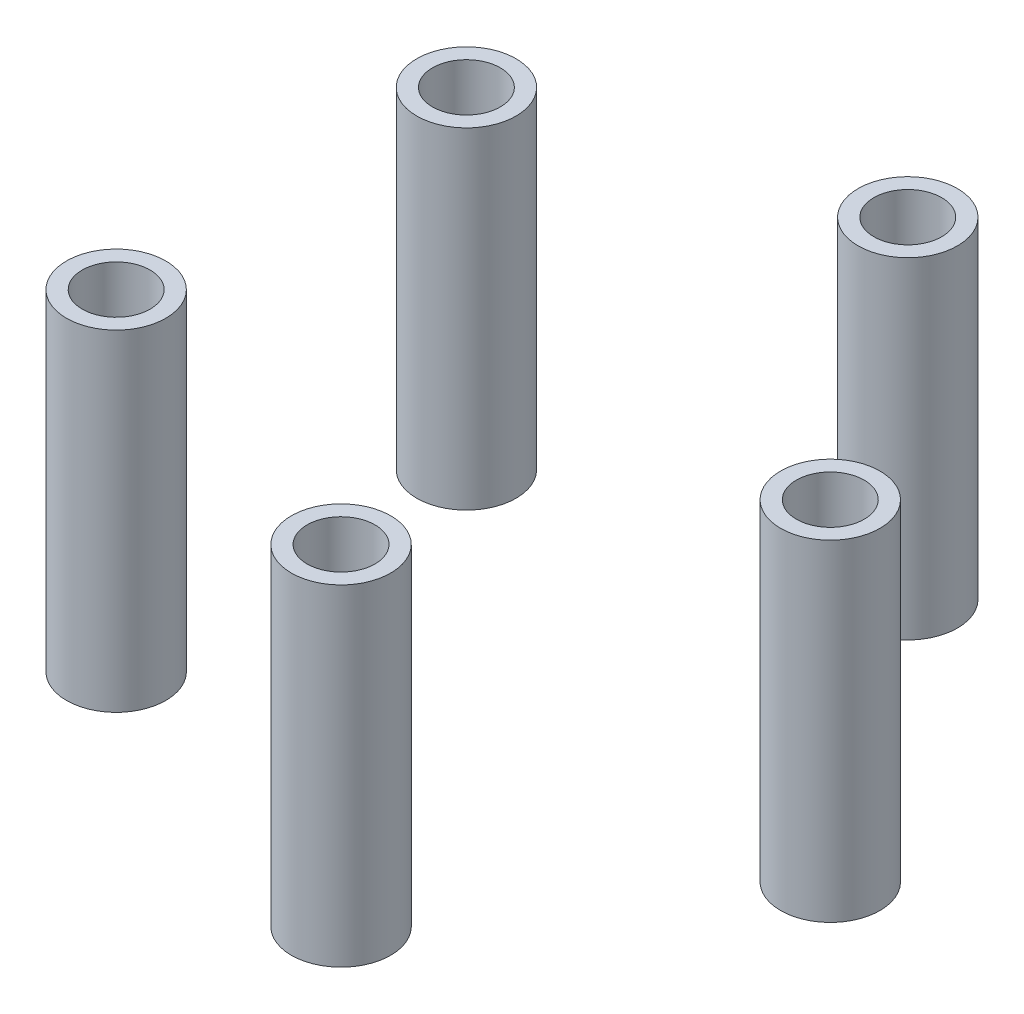
ISO-10303-21;
HEADER;
FILE_DESCRIPTION(('STEP AP214'),'2;1');
FILE_NAME('part.step','',(''),(''),'','','');
FILE_SCHEMA(('AUTOMOTIVE_DESIGN { 1 0 10303 214 1 1 1 1 }'));
ENDSEC;
DATA;
#1=APPLICATION_CONTEXT('core data for automotive mechanical design processes');
#2=APPLICATION_PROTOCOL_DEFINITION('international standard','automotive_design',2000,#1);
#3=PRODUCT_CONTEXT('',#1,'mechanical');
#4=PRODUCT('Part','Part','',(#3));
#5=PRODUCT_RELATED_PRODUCT_CATEGORY('part','',(#4));
#6=PRODUCT_DEFINITION_FORMATION('','',#4);
#7=PRODUCT_DEFINITION_CONTEXT('part definition',#1,'design');
#8=PRODUCT_DEFINITION('design','',#6,#7);
#9=PRODUCT_DEFINITION_SHAPE('','',#8);
#10=(LENGTH_UNIT() NAMED_UNIT(*) SI_UNIT(.MILLI.,.METRE.));
#11=(NAMED_UNIT(*) PLANE_ANGLE_UNIT() SI_UNIT($,.RADIAN.));
#12=(NAMED_UNIT(*) SI_UNIT($,.STERADIAN.) SOLID_ANGLE_UNIT());
#13=UNCERTAINTY_MEASURE_WITH_UNIT(LENGTH_MEASURE(1.E-05),#10,'distance_accuracy_value','');
#14=(GEOMETRIC_REPRESENTATION_CONTEXT(3) GLOBAL_UNCERTAINTY_ASSIGNED_CONTEXT((#13)) GLOBAL_UNIT_ASSIGNED_CONTEXT((#10,
#11,#12)) REPRESENTATION_CONTEXT('',''));
#15=CARTESIAN_POINT('',(0.,0.,0.));
#16=DIRECTION('',(0.,0.,1.));
#17=DIRECTION('',(1.,0.,0.));
#18=AXIS2_PLACEMENT_3D('',#15,#16,#17);
#19=CARTESIAN_POINT('',(4.36230589877687,-8.,-17.1190172933127));
#20=DIRECTION('',(0.,1.,0.));
#21=DIRECTION('',(0.,0.,1.));
#22=AXIS2_PLACEMENT_3D('',#19,#20,#21);
#23=CYLINDRICAL_SURFACE('',#22,3.);
#24=CARTESIAN_POINT('',(4.36230589877687,-8.,-17.1190172933127));
#25=DIRECTION('',(0.,1.,0.));
#26=DIRECTION('',(0.,0.,1.));
#27=AXIS2_PLACEMENT_3D('',#24,#25,#26);
#28=CIRCLE('',#27,3.);
#29=CARTESIAN_POINT('',(4.36230589877687,-8.,-14.1190172933127));
#30=VERTEX_POINT('',#29);
#31=EDGE_CURVE('E62',#30,#30,#28,.T.);
#32=ORIENTED_EDGE('',*,*,#31,.T.);
#33=EDGE_LOOP('',(#32));
#34=FACE_BOUND('',#33,.T.);
#35=CARTESIAN_POINT('',(4.36230589877687,12.,-17.1190172933127));
#36=DIRECTION('',(0.,1.,0.));
#37=DIRECTION('',(0.,0.,1.));
#38=AXIS2_PLACEMENT_3D('',#35,#36,#37);
#39=CIRCLE('',#38,3.);
#40=CARTESIAN_POINT('',(4.36230589877687,12.,-14.1190172933127));
#41=VERTEX_POINT('',#40);
#42=EDGE_CURVE('E52',#41,#41,#39,.T.);
#43=ORIENTED_EDGE('',*,*,#42,.F.);
#44=EDGE_LOOP('',(#43));
#45=FACE_BOUND('',#44,.T.);
#46=ADVANCED_FACE('F46',(#34,#45),#23,.T.);
#47=CARTESIAN_POINT('',(4.36230589877687,-8.,-17.1190172933127));
#48=DIRECTION('',(0.,1.,0.));
#49=DIRECTION('',(0.,0.,1.));
#50=AXIS2_PLACEMENT_3D('',#47,#48,#49);
#51=PLANE('',#50);
#52=CARTESIAN_POINT('',(4.36230589877687,-8.,-17.1190172933127));
#53=DIRECTION('',(0.,1.,0.));
#54=DIRECTION('',(0.,0.,1.));
#55=AXIS2_PLACEMENT_3D('',#52,#53,#54);
#56=CIRCLE('',#55,2.05);
#57=CARTESIAN_POINT('',(4.36230589877687,-8.,-15.0690172933127));
#58=VERTEX_POINT('',#57);
#59=EDGE_CURVE('E60',#58,#58,#56,.T.);
#60=ORIENTED_EDGE('',*,*,#59,.T.);
#61=EDGE_LOOP('',(#60));
#62=FACE_BOUND('',#61,.T.);
#63=ORIENTED_EDGE('',*,*,#31,.F.);
#64=EDGE_LOOP('',(#63));
#65=FACE_BOUND('',#64,.T.);
#66=ADVANCED_FACE('F69',(#62,#65),#51,.F.);
#67=CARTESIAN_POINT('',(4.36230589877687,-8.,-17.1190172933127));
#68=DIRECTION('',(0.,1.,0.));
#69=DIRECTION('',(0.,0.,1.));
#70=AXIS2_PLACEMENT_3D('',#67,#68,#69);
#71=CYLINDRICAL_SURFACE('',#70,2.05);
#72=ORIENTED_EDGE('',*,*,#59,.F.);
#73=EDGE_LOOP('',(#72));
#74=FACE_BOUND('',#73,.T.);
#75=CARTESIAN_POINT('',(4.36230589877687,12.,-17.1190172933127));
#76=DIRECTION('',(0.,1.,0.));
#77=DIRECTION('',(0.,0.,1.));
#78=AXIS2_PLACEMENT_3D('',#75,#76,#77);
#79=CIRCLE('',#78,2.05);
#80=CARTESIAN_POINT('',(4.36230589877687,12.,-15.0690172933127));
#81=VERTEX_POINT('',#80);
#82=EDGE_CURVE('E11',#81,#81,#79,.T.);
#83=ORIENTED_EDGE('',*,*,#82,.T.);
#84=EDGE_LOOP('',(#83));
#85=FACE_BOUND('',#84,.T.);
#86=ADVANCED_FACE('F72',(#74,#85),#71,.F.);
#87=CARTESIAN_POINT('',(4.36230589877687,12.,-17.1190172933127));
#88=DIRECTION('',(0.,1.,0.));
#89=DIRECTION('',(0.,0.,1.));
#90=AXIS2_PLACEMENT_3D('',#87,#88,#89);
#91=PLANE('',#90);
#92=ORIENTED_EDGE('',*,*,#42,.T.);
#93=EDGE_LOOP('',(#92));
#94=FACE_BOUND('',#93,.T.);
#95=ORIENTED_EDGE('',*,*,#82,.F.);
#96=EDGE_LOOP('',(#95));
#97=FACE_BOUND('',#96,.T.);
#98=ADVANCED_FACE('F48',(#94,#97),#91,.T.);
#99=CLOSED_SHELL('',(#46,#66,#86,#98));
#100=MANIFOLD_SOLID_BREP('B2',#99);
#101=CARTESIAN_POINT('',(-15.7623058987213,-8.,-10.5801345412646));
#102=DIRECTION('',(0.,1.,0.));
#103=DIRECTION('',(0.,0.,1.));
#104=AXIS2_PLACEMENT_3D('',#101,#102,#103);
#105=CYLINDRICAL_SURFACE('',#104,3.);
#106=CARTESIAN_POINT('',(-15.7623058987213,-8.,-10.5801345412646));
#107=DIRECTION('',(0.,1.,0.));
#108=DIRECTION('',(0.,0.,1.));
#109=AXIS2_PLACEMENT_3D('',#106,#107,#108);
#110=CIRCLE('',#109,3.);
#111=CARTESIAN_POINT('',(-15.7623058987213,-8.,-7.58013454126464));
#112=VERTEX_POINT('',#111);
#113=EDGE_CURVE('E131',#112,#112,#110,.T.);
#114=ORIENTED_EDGE('',*,*,#113,.T.);
#115=EDGE_LOOP('',(#114));
#116=FACE_BOUND('',#115,.T.);
#117=CARTESIAN_POINT('',(-15.7623058987213,12.,-10.5801345412646));
#118=DIRECTION('',(0.,1.,0.));
#119=DIRECTION('',(0.,0.,1.));
#120=AXIS2_PLACEMENT_3D('',#117,#118,#119);
#121=CIRCLE('',#120,3.);
#122=CARTESIAN_POINT('',(-15.7623058987213,12.,-7.58013454126464));
#123=VERTEX_POINT('',#122);
#124=EDGE_CURVE('E121',#123,#123,#121,.T.);
#125=ORIENTED_EDGE('',*,*,#124,.F.);
#126=EDGE_LOOP('',(#125));
#127=FACE_BOUND('',#126,.T.);
#128=ADVANCED_FACE('F117',(#116,#127),#105,.T.);
#129=CARTESIAN_POINT('',(-15.7623058987213,-8.,-10.5801345412646));
#130=DIRECTION('',(0.,1.,0.));
#131=DIRECTION('',(0.,0.,1.));
#132=AXIS2_PLACEMENT_3D('',#129,#130,#131);
#133=PLANE('',#132);
#134=CARTESIAN_POINT('',(-15.7623058987213,-8.,-10.5801345412646));
#135=DIRECTION('',(0.,1.,0.));
#136=DIRECTION('',(0.,0.,1.));
#137=AXIS2_PLACEMENT_3D('',#134,#135,#136);
#138=CIRCLE('',#137,2.05);
#139=CARTESIAN_POINT('',(-15.7623058987213,-8.,-8.53013454126464));
#140=VERTEX_POINT('',#139);
#141=EDGE_CURVE('E130',#140,#140,#138,.T.);
#142=ORIENTED_EDGE('',*,*,#141,.T.);
#143=EDGE_LOOP('',(#142));
#144=FACE_BOUND('',#143,.T.);
#145=ORIENTED_EDGE('',*,*,#113,.F.);
#146=EDGE_LOOP('',(#145));
#147=FACE_BOUND('',#146,.T.);
#148=ADVANCED_FACE('F137',(#144,#147),#133,.F.);
#149=CARTESIAN_POINT('',(-15.7623058987213,-8.,-10.5801345412646));
#150=DIRECTION('',(0.,1.,0.));
#151=DIRECTION('',(0.,0.,1.));
#152=AXIS2_PLACEMENT_3D('',#149,#150,#151);
#153=CYLINDRICAL_SURFACE('',#152,2.05);
#154=ORIENTED_EDGE('',*,*,#141,.F.);
#155=EDGE_LOOP('',(#154));
#156=FACE_BOUND('',#155,.T.);
#157=CARTESIAN_POINT('',(-15.7623058987213,12.,-10.5801345412646));
#158=DIRECTION('',(0.,1.,0.));
#159=DIRECTION('',(0.,0.,1.));
#160=AXIS2_PLACEMENT_3D('',#157,#158,#159);
#161=CIRCLE('',#160,2.05);
#162=CARTESIAN_POINT('',(-15.7623058987213,12.,-8.53013454126464));
#163=VERTEX_POINT('',#162);
#164=EDGE_CURVE('E44',#163,#163,#161,.T.);
#165=ORIENTED_EDGE('',*,*,#164,.T.);
#166=EDGE_LOOP('',(#165));
#167=FACE_BOUND('',#166,.T.);
#168=ADVANCED_FACE('F141',(#156,#167),#153,.F.);
#169=CARTESIAN_POINT('',(-15.7623058987213,12.,-10.5801345412646));
#170=DIRECTION('',(0.,1.,0.));
#171=DIRECTION('',(0.,0.,1.));
#172=AXIS2_PLACEMENT_3D('',#169,#170,#171);
#173=PLANE('',#172);
#174=ORIENTED_EDGE('',*,*,#124,.T.);
#175=EDGE_LOOP('',(#174));
#176=FACE_BOUND('',#175,.T.);
#177=ORIENTED_EDGE('',*,*,#164,.F.);
#178=EDGE_LOOP('',(#177));
#179=FACE_BOUND('',#178,.T.);
#180=ADVANCED_FACE('F118',(#176,#179),#173,.T.);
#181=CLOSED_SHELL('',(#128,#148,#168,#180));
#182=MANIFOLD_SOLID_BREP('B6',#181);
#183=CARTESIAN_POINT('',(16.8000000000276,-8.,0.));
#184=DIRECTION('',(0.,1.,0.));
#185=DIRECTION('',(0.,0.,1.));
#186=AXIS2_PLACEMENT_3D('',#183,#184,#185);
#187=CYLINDRICAL_SURFACE('',#186,3.);
#188=CARTESIAN_POINT('',(16.8000000000276,-8.,0.));
#189=DIRECTION('',(0.,1.,0.));
#190=DIRECTION('',(0.,0.,1.));
#191=AXIS2_PLACEMENT_3D('',#188,#189,#190);
#192=CIRCLE('',#191,3.);
#193=CARTESIAN_POINT('',(16.8000000000276,-8.,3.));
#194=VERTEX_POINT('',#193);
#195=EDGE_CURVE('E202',#194,#194,#192,.T.);
#196=ORIENTED_EDGE('',*,*,#195,.T.);
#197=EDGE_LOOP('',(#196));
#198=FACE_BOUND('',#197,.T.);
#199=CARTESIAN_POINT('',(16.8000000000276,12.,0.));
#200=DIRECTION('',(0.,1.,0.));
#201=DIRECTION('',(0.,0.,1.));
#202=AXIS2_PLACEMENT_3D('',#199,#200,#201);
#203=CIRCLE('',#202,3.);
#204=CARTESIAN_POINT('',(16.8000000000276,12.,3.));
#205=VERTEX_POINT('',#204);
#206=EDGE_CURVE('E194',#205,#205,#203,.T.);
#207=ORIENTED_EDGE('',*,*,#206,.F.);
#208=EDGE_LOOP('',(#207));
#209=FACE_BOUND('',#208,.T.);
#210=ADVANCED_FACE('F186',(#198,#209),#187,.T.);
#211=CARTESIAN_POINT('',(16.8000000000276,-8.,0.));
#212=DIRECTION('',(0.,1.,0.));
#213=DIRECTION('',(0.,0.,1.));
#214=AXIS2_PLACEMENT_3D('',#211,#212,#213);
#215=PLANE('',#214);
#216=CARTESIAN_POINT('',(16.8000000000276,-8.,0.));
#217=DIRECTION('',(0.,1.,0.));
#218=DIRECTION('',(0.,0.,1.));
#219=AXIS2_PLACEMENT_3D('',#216,#217,#218);
#220=CIRCLE('',#219,2.05);
#221=CARTESIAN_POINT('',(16.8000000000276,-8.,2.05));
#222=VERTEX_POINT('',#221);
#223=EDGE_CURVE('E200',#222,#222,#220,.T.);
#224=ORIENTED_EDGE('',*,*,#223,.T.);
#225=EDGE_LOOP('',(#224));
#226=FACE_BOUND('',#225,.T.);
#227=ORIENTED_EDGE('',*,*,#195,.F.);
#228=EDGE_LOOP('',(#227));
#229=FACE_BOUND('',#228,.T.);
#230=ADVANCED_FACE('F209',(#226,#229),#215,.F.);
#231=CARTESIAN_POINT('',(16.8000000000276,-8.,0.));
#232=DIRECTION('',(0.,1.,0.));
#233=DIRECTION('',(0.,0.,1.));
#234=AXIS2_PLACEMENT_3D('',#231,#232,#233);
#235=CYLINDRICAL_SURFACE('',#234,2.05);
#236=ORIENTED_EDGE('',*,*,#223,.F.);
#237=EDGE_LOOP('',(#236));
#238=FACE_BOUND('',#237,.T.);
#239=CARTESIAN_POINT('',(16.8000000000276,12.,0.));
#240=DIRECTION('',(0.,1.,0.));
#241=DIRECTION('',(0.,0.,1.));
#242=AXIS2_PLACEMENT_3D('',#239,#240,#241);
#243=CIRCLE('',#242,2.05);
#244=CARTESIAN_POINT('',(16.8000000000276,12.,2.05));
#245=VERTEX_POINT('',#244);
#246=EDGE_CURVE('E113',#245,#245,#243,.T.);
#247=ORIENTED_EDGE('',*,*,#246,.T.);
#248=EDGE_LOOP('',(#247));
#249=FACE_BOUND('',#248,.T.);
#250=ADVANCED_FACE('F213',(#238,#249),#235,.F.);
#251=CARTESIAN_POINT('',(16.8000000000276,12.,0.));
#252=DIRECTION('',(0.,1.,0.));
#253=DIRECTION('',(0.,0.,1.));
#254=AXIS2_PLACEMENT_3D('',#251,#252,#253);
#255=PLANE('',#254);
#256=ORIENTED_EDGE('',*,*,#206,.T.);
#257=EDGE_LOOP('',(#256));
#258=FACE_BOUND('',#257,.T.);
#259=ORIENTED_EDGE('',*,*,#246,.F.);
#260=EDGE_LOOP('',(#259));
#261=FACE_BOUND('',#260,.T.);
#262=ADVANCED_FACE('F187',(#258,#261),#255,.T.);
#263=CLOSED_SHELL('',(#210,#230,#250,#262));
#264=MANIFOLD_SOLID_BREP('B37',#263);
#265=CARTESIAN_POINT('',(4.36230589877663,-8.,17.1190172933128));
#266=DIRECTION('',(0.,1.,0.));
#267=DIRECTION('',(0.,0.,1.));
#268=AXIS2_PLACEMENT_3D('',#265,#266,#267);
#269=CYLINDRICAL_SURFACE('',#268,3.);
#270=CARTESIAN_POINT('',(4.36230589877663,-8.,17.1190172933128));
#271=DIRECTION('',(0.,1.,0.));
#272=DIRECTION('',(0.,0.,1.));
#273=AXIS2_PLACEMENT_3D('',#270,#271,#272);
#274=CIRCLE('',#273,3.);
#275=CARTESIAN_POINT('',(4.36230589877663,-8.,20.1190172933128));
#276=VERTEX_POINT('',#275);
#277=EDGE_CURVE('E269',#276,#276,#274,.T.);
#278=ORIENTED_EDGE('',*,*,#277,.T.);
#279=EDGE_LOOP('',(#278));
#280=FACE_BOUND('',#279,.T.);
#281=CARTESIAN_POINT('',(4.36230589877663,12.,17.1190172933128));
#282=DIRECTION('',(0.,1.,0.));
#283=DIRECTION('',(0.,0.,1.));
#284=AXIS2_PLACEMENT_3D('',#281,#282,#283);
#285=CIRCLE('',#284,3.);
#286=CARTESIAN_POINT('',(4.36230589877663,12.,20.1190172933128));
#287=VERTEX_POINT('',#286);
#288=EDGE_CURVE('E265',#287,#287,#285,.T.);
#289=ORIENTED_EDGE('',*,*,#288,.F.);
#290=EDGE_LOOP('',(#289));
#291=FACE_BOUND('',#290,.T.);
#292=ADVANCED_FACE('F251',(#280,#291),#269,.T.);
#293=CARTESIAN_POINT('',(4.36230589877663,-8.,17.1190172933128));
#294=DIRECTION('',(0.,1.,0.));
#295=DIRECTION('',(0.,0.,1.));
#296=AXIS2_PLACEMENT_3D('',#293,#294,#295);
#297=PLANE('',#296);
#298=CARTESIAN_POINT('',(4.36230589877663,-8.,17.1190172933128));
#299=DIRECTION('',(0.,1.,0.));
#300=DIRECTION('',(0.,0.,1.));
#301=AXIS2_PLACEMENT_3D('',#298,#299,#300);
#302=CIRCLE('',#301,2.05);
#303=CARTESIAN_POINT('',(4.36230589877663,-8.,19.1690172933128));
#304=VERTEX_POINT('',#303);
#305=EDGE_CURVE('E266',#304,#304,#302,.T.);
#306=ORIENTED_EDGE('',*,*,#305,.T.);
#307=EDGE_LOOP('',(#306));
#308=FACE_BOUND('',#307,.T.);
#309=ORIENTED_EDGE('',*,*,#277,.F.);
#310=EDGE_LOOP('',(#309));
#311=FACE_BOUND('',#310,.T.);
#312=ADVANCED_FACE('F277',(#308,#311),#297,.F.);
#313=CARTESIAN_POINT('',(4.36230589877663,-8.,17.1190172933128));
#314=DIRECTION('',(0.,1.,0.));
#315=DIRECTION('',(0.,0.,1.));
#316=AXIS2_PLACEMENT_3D('',#313,#314,#315);
#317=CYLINDRICAL_SURFACE('',#316,2.05);
#318=ORIENTED_EDGE('',*,*,#305,.F.);
#319=EDGE_LOOP('',(#318));
#320=FACE_BOUND('',#319,.T.);
#321=CARTESIAN_POINT('',(4.36230589877663,12.,17.1190172933128));
#322=DIRECTION('',(0.,1.,0.));
#323=DIRECTION('',(0.,0.,1.));
#324=AXIS2_PLACEMENT_3D('',#321,#322,#323);
#325=CIRCLE('',#324,2.05);
#326=CARTESIAN_POINT('',(4.36230589877663,12.,19.1690172933128));
#327=VERTEX_POINT('',#326);
#328=EDGE_CURVE('E184',#327,#327,#325,.T.);
#329=ORIENTED_EDGE('',*,*,#328,.T.);
#330=EDGE_LOOP('',(#329));
#331=FACE_BOUND('',#330,.T.);
#332=ADVANCED_FACE('F279',(#320,#331),#317,.F.);
#333=CARTESIAN_POINT('',(4.36230589877663,12.,17.1190172933128));
#334=DIRECTION('',(0.,1.,0.));
#335=DIRECTION('',(0.,0.,1.));
#336=AXIS2_PLACEMENT_3D('',#333,#334,#335);
#337=PLANE('',#336);
#338=ORIENTED_EDGE('',*,*,#288,.T.);
#339=EDGE_LOOP('',(#338));
#340=FACE_BOUND('',#339,.T.);
#341=ORIENTED_EDGE('',*,*,#328,.F.);
#342=EDGE_LOOP('',(#341));
#343=FACE_BOUND('',#342,.T.);
#344=ADVANCED_FACE('F257',(#340,#343),#337,.T.);
#345=CLOSED_SHELL('',(#292,#312,#332,#344));
#346=MANIFOLD_SOLID_BREP('B106',#345);
#347=CARTESIAN_POINT('',(-15.7623058987215,-8.,10.5801345412644));
#348=DIRECTION('',(0.,1.,0.));
#349=DIRECTION('',(0.,0.,1.));
#350=AXIS2_PLACEMENT_3D('',#347,#348,#349);
#351=CYLINDRICAL_SURFACE('',#350,3.);
#352=CARTESIAN_POINT('',(-15.7623058987215,-8.,10.5801345412644));
#353=DIRECTION('',(0.,1.,0.));
#354=DIRECTION('',(0.,0.,1.));
#355=AXIS2_PLACEMENT_3D('',#352,#353,#354);
#356=CIRCLE('',#355,3.);
#357=CARTESIAN_POINT('',(-15.7623058987215,-8.,13.5801345412644));
#358=VERTEX_POINT('',#357);
#359=EDGE_CURVE('E254',#358,#358,#356,.T.);
#360=ORIENTED_EDGE('',*,*,#359,.T.);
#361=EDGE_LOOP('',(#360));
#362=FACE_BOUND('',#361,.T.);
#363=CARTESIAN_POINT('',(-15.7623058987215,12.,10.5801345412644));
#364=DIRECTION('',(0.,1.,0.));
#365=DIRECTION('',(0.,0.,1.));
#366=AXIS2_PLACEMENT_3D('',#363,#364,#365);
#367=CIRCLE('',#366,3.);
#368=CARTESIAN_POINT('',(-15.7623058987215,12.,13.5801345412644));
#369=VERTEX_POINT('',#368);
#370=EDGE_CURVE('E330',#369,#369,#367,.T.);
#371=ORIENTED_EDGE('',*,*,#370,.F.);
#372=EDGE_LOOP('',(#371));
#373=FACE_BOUND('',#372,.T.);
#374=ADVANCED_FACE('F320',(#362,#373),#351,.T.);
#375=CARTESIAN_POINT('',(-15.7623058987215,-8.,10.5801345412644));
#376=DIRECTION('',(0.,1.,0.));
#377=DIRECTION('',(0.,0.,1.));
#378=AXIS2_PLACEMENT_3D('',#375,#376,#377);
#379=PLANE('',#378);
#380=CARTESIAN_POINT('',(-15.7623058987215,-8.,10.5801345412644));
#381=DIRECTION('',(0.,1.,0.));
#382=DIRECTION('',(0.,0.,1.));
#383=AXIS2_PLACEMENT_3D('',#380,#381,#382);
#384=CIRCLE('',#383,2.05);
#385=CARTESIAN_POINT('',(-15.7623058987215,-8.,12.6301345412644));
#386=VERTEX_POINT('',#385);
#387=EDGE_CURVE('E322',#386,#386,#384,.T.);
#388=ORIENTED_EDGE('',*,*,#387,.T.);
#389=EDGE_LOOP('',(#388));
#390=FACE_BOUND('',#389,.T.);
#391=ORIENTED_EDGE('',*,*,#359,.F.);
#392=EDGE_LOOP('',(#391));
#393=FACE_BOUND('',#392,.T.);
#394=ADVANCED_FACE('F348',(#390,#393),#379,.F.);
#395=CARTESIAN_POINT('',(-15.7623058987215,-8.,10.5801345412644));
#396=DIRECTION('',(0.,1.,0.));
#397=DIRECTION('',(0.,0.,1.));
#398=AXIS2_PLACEMENT_3D('',#395,#396,#397);
#399=CYLINDRICAL_SURFACE('',#398,2.05);
#400=ORIENTED_EDGE('',*,*,#387,.F.);
#401=EDGE_LOOP('',(#400));
#402=FACE_BOUND('',#401,.T.);
#403=CARTESIAN_POINT('',(-15.7623058987215,12.,10.5801345412644));
#404=DIRECTION('',(0.,1.,0.));
#405=DIRECTION('',(0.,0.,1.));
#406=AXIS2_PLACEMENT_3D('',#403,#404,#405);
#407=CIRCLE('',#406,2.05);
#408=CARTESIAN_POINT('',(-15.7623058987215,12.,12.6301345412644));
#409=VERTEX_POINT('',#408);
#410=EDGE_CURVE('E332',#409,#409,#407,.T.);
#411=ORIENTED_EDGE('',*,*,#410,.T.);
#412=EDGE_LOOP('',(#411));
#413=FACE_BOUND('',#412,.T.);
#414=ADVANCED_FACE('F340',(#402,#413),#399,.F.);
#415=CARTESIAN_POINT('',(-15.7623058987215,12.,10.5801345412644));
#416=DIRECTION('',(0.,1.,0.));
#417=DIRECTION('',(0.,0.,1.));
#418=AXIS2_PLACEMENT_3D('',#415,#416,#417);
#419=PLANE('',#418);
#420=ORIENTED_EDGE('',*,*,#370,.T.);
#421=EDGE_LOOP('',(#420));
#422=FACE_BOUND('',#421,.T.);
#423=ORIENTED_EDGE('',*,*,#410,.F.);
#424=EDGE_LOOP('',(#423));
#425=FACE_BOUND('',#424,.T.);
#426=ADVANCED_FACE('F339',(#422,#425),#419,.T.);
#427=CLOSED_SHELL('',(#374,#394,#414,#426));
#428=MANIFOLD_SOLID_BREP('B179',#427);
#429=ADVANCED_BREP_SHAPE_REPRESENTATION('',(#18,#100,#182,#264,#346,#428),#14);
#430=SHAPE_DEFINITION_REPRESENTATION(#9,#429);
ENDSEC;
END-ISO-10303-21;
